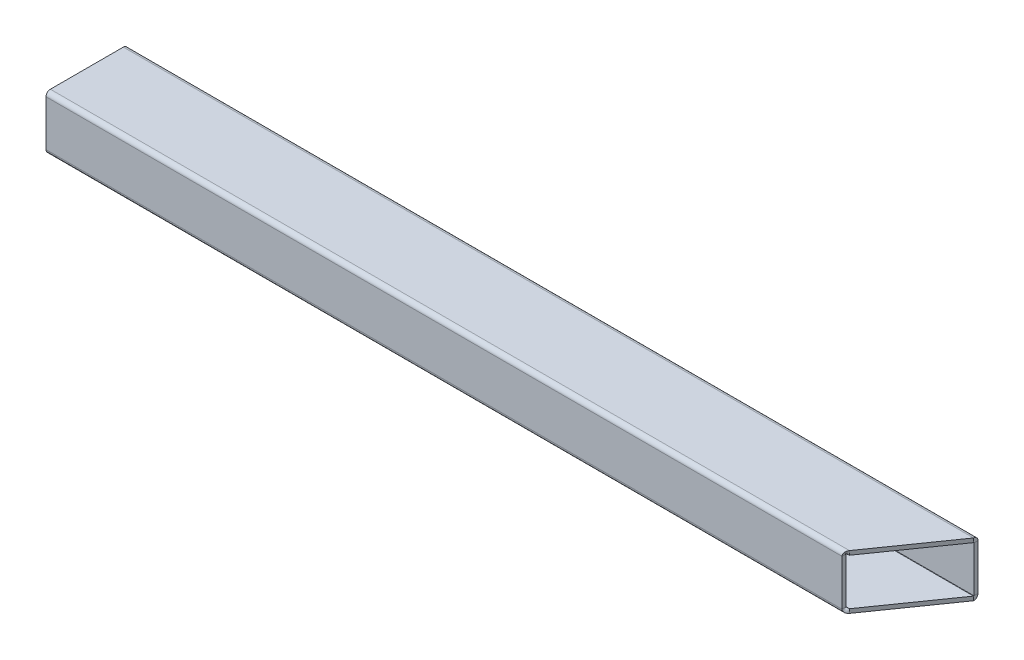
ISO-10303-21;
HEADER;
FILE_DESCRIPTION(('STEP AP214'),'2;1');
FILE_NAME('part.step','',(''),(''),'','','');
FILE_SCHEMA(('AUTOMOTIVE_DESIGN { 1 0 10303 214 1 1 1 1 }'));
ENDSEC;
DATA;
#1=APPLICATION_CONTEXT('core data for automotive mechanical design processes');
#2=APPLICATION_PROTOCOL_DEFINITION('international standard','automotive_design',2000,#1);
#3=PRODUCT_CONTEXT('',#1,'mechanical');
#4=PRODUCT('Part','Part','',(#3));
#5=PRODUCT_RELATED_PRODUCT_CATEGORY('part','',(#4));
#6=PRODUCT_DEFINITION_FORMATION('','',#4);
#7=PRODUCT_DEFINITION_CONTEXT('part definition',#1,'design');
#8=PRODUCT_DEFINITION('design','',#6,#7);
#9=PRODUCT_DEFINITION_SHAPE('','',#8);
#10=(LENGTH_UNIT() NAMED_UNIT(*) SI_UNIT(.MILLI.,.METRE.));
#11=(NAMED_UNIT(*) PLANE_ANGLE_UNIT() SI_UNIT($,.RADIAN.));
#12=(NAMED_UNIT(*) SI_UNIT($,.STERADIAN.) SOLID_ANGLE_UNIT());
#13=UNCERTAINTY_MEASURE_WITH_UNIT(LENGTH_MEASURE(1.E-05),#10,'distance_accuracy_value','');
#14=(GEOMETRIC_REPRESENTATION_CONTEXT(3) GLOBAL_UNCERTAINTY_ASSIGNED_CONTEXT((#13)) GLOBAL_UNIT_ASSIGNED_CONTEXT((#10,
#11,#12)) REPRESENTATION_CONTEXT('',''));
#15=CARTESIAN_POINT('',(0.,0.,0.));
#16=DIRECTION('',(0.,0.,1.));
#17=DIRECTION('',(1.,0.,0.));
#18=AXIS2_PLACEMENT_3D('',#15,#16,#17);
#19=CARTESIAN_POINT('',(624.619294370087,-16.8,-26.6));
#20=CARTESIAN_POINT('',(624.619294370087,-16.8,-25.6));
#21=CARTESIAN_POINT('',(624.619294370087,-16.8,-24.6));
#22=CARTESIAN_POINT('',(624.619294370087,-16.8,-23.6));
#23=CARTESIAN_POINT('',(624.619294370087,-16.4,-26.6));
#24=CARTESIAN_POINT('',(624.619294370087,-14.4,-25.6));
#25=CARTESIAN_POINT('',(624.619294370087,-12.4,-24.6));
#26=CARTESIAN_POINT('',(624.619294370087,-10.4,-23.6));
#27=CARTESIAN_POINT('',(624.899377385371,-16.4,-27.));
#28=CARTESIAN_POINT('',(624.899377385371,-14.4,-28.));
#29=CARTESIAN_POINT('',(624.899377385371,-12.4,-29.));
#30=CARTESIAN_POINT('',(624.899377385371,-10.4,-30.));
#31=CARTESIAN_POINT('',(624.899377385371,-16.8,-27.));
#32=CARTESIAN_POINT('',(624.899377385371,-16.8,-28.));
#33=CARTESIAN_POINT('',(624.899377385371,-16.8,-29.));
#34=CARTESIAN_POINT('',(624.899377385371,-16.8,-30.));
#35=CARTESIAN_POINT('',(624.899377385371,-17.2,-27.));
#36=CARTESIAN_POINT('',(624.899377385371,-19.2,-28.));
#37=CARTESIAN_POINT('',(624.899377385371,-21.2,-29.));
#38=CARTESIAN_POINT('',(624.899377385371,-23.2,-30.));
#39=CARTESIAN_POINT('',(624.619294370087,-17.2,-26.6));
#40=CARTESIAN_POINT('',(624.619294370087,-19.2,-25.6));
#41=CARTESIAN_POINT('',(624.619294370087,-21.2,-24.6));
#42=CARTESIAN_POINT('',(624.619294370087,-23.2,-23.6));
#43=CARTESIAN_POINT('',(624.619294370087,-16.8,-26.6));
#44=CARTESIAN_POINT('',(624.619294370087,-16.8,-25.6));
#45=CARTESIAN_POINT('',(624.619294370087,-16.8,-24.6));
#46=CARTESIAN_POINT('',(624.619294370087,-16.8,-23.6));
#47=(BOUNDED_SURFACE() B_SPLINE_SURFACE(3,3,((#19,#20,#21,#22),(#23,#24,#25,#26),(#27,#28,#29,
#30),(#31,#32,#33,#34),(#35,#36,#37,#38),(#39,#40,#41,#42),(#43,#44,#45,#46)),.UNSPECIFIED.,.T.,
.F.,.F.) B_SPLINE_SURFACE_WITH_KNOTS((4,3,4),(4,4),(0.,0.5,1.),(0.,1.),
.UNSPECIFIED.) GEOMETRIC_REPRESENTATION_ITEM() RATIONAL_B_SPLINE_SURFACE(((1.,1.,1.,1.),
(0.333333333333333,0.333333333333333,0.333333333333333,0.333333333333333),(0.333333333333333,
0.333333333333333,0.333333333333333,0.333333333333333),(1.,1.,1.,1.),(0.333333333333333,
0.333333333333333,0.333333333333333,0.333333333333333),(0.333333333333333,0.333333333333333,
0.333333333333333,0.333333333333333),(1.,1.,1.,1.))) REPRESENTATION_ITEM('') SURFACE());
#48=DIRECTION('',(0.,1.,0.));
#49=VECTOR('',#48,1.);
#50=CARTESIAN_POINT('',(624.759335877729,-17.,-26.8));
#51=LINE('',#50,#49);
#52=CARTESIAN_POINT('',(624.759335877729,-20.,-26.8));
#53=VERTEX_POINT('',#52);
#54=CARTESIAN_POINT('',(624.759335877729,-17.,-26.8));
#55=VERTEX_POINT('',#54);
#56=EDGE_CURVE('E12',#53,#55,#51,.T.);
#57=CARTESIAN_POINT('',(624.759335877729,-16.8,-26.8));
#58=DIRECTION('',(-0.999043774480225,0.,-0.0437211238682728));
#59=DIRECTION('',(-0.0437211238682728,0.,0.999043774480225));
#60=AXIS2_PLACEMENT_3D('',#57,#58,#59);
#61=ELLIPSE('',#60,3.20306285043904,3.20000000000001);
#62=CARTESIAN_POINT('',(624.899377385371,-16.7999999999999,-30.));
#63=VERTEX_POINT('',#62);
#64=EDGE_CURVE('E316',#63,#53,#61,.T.);
#65=DIRECTION('',(0.,0.,1.));
#66=VECTOR('',#65,1.);
#67=CARTESIAN_POINT('',(624.899377385371,-16.8,-27.));
#68=LINE('',#67,#66);
#69=CARTESIAN_POINT('',(624.899377385371,-16.8,-27.));
#70=VERTEX_POINT('',#69);
#71=EDGE_CURVE('E88',#63,#70,#68,.T.);
#72=CARTESIAN_POINT('',(624.759335877729,-16.8,-26.8));
#73=DIRECTION('',(-0.819152044288994,0.,-0.573576436351043));
#74=DIRECTION('',(-0.573576436351043,0.,0.819152044288994));
#75=AXIS2_PLACEMENT_3D('',#72,#73,#74);
#76=ELLIPSE('',#75,0.244154917752293,0.200000000000002);
#77=EDGE_CURVE('E284',#70,#55,#76,.T.);
#78=ORIENTED_EDGE('',*,*,#56,.F.);
#79=ORIENTED_EDGE('',*,*,#64,.F.);
#80=ORIENTED_EDGE('',*,*,#71,.T.);
#81=ORIENTED_EDGE('',*,*,#77,.T.);
#82=EDGE_LOOP('',(#78,#79,#80,#81));
#83=FACE_BOUND('',#82,.T.);
#84=ADVANCED_FACE('F80',(#83),#47,.T.);
#85=CARTESIAN_POINT('',(624.899377385371,-16.8,-27.));
#86=DIRECTION('',(-1.,0.,0.));
#87=DIRECTION('',(0.,-1.,0.));
#88=AXIS2_PLACEMENT_3D('',#85,#86,#87);
#89=PLANE('',#88);
#90=ORIENTED_EDGE('',*,*,#71,.F.);
#91=DIRECTION('',(0.,1.,0.));
#92=VECTOR('',#91,1.);
#93=CARTESIAN_POINT('',(624.899377385371,-16.8,-30.));
#94=LINE('',#93,#92);
#95=CARTESIAN_POINT('',(624.899377385371,16.8,-30.));
#96=VERTEX_POINT('',#95);
#97=EDGE_CURVE('E312',#96,#63,#94,.F.);
#98=ORIENTED_EDGE('',*,*,#97,.F.);
#99=DIRECTION('',(0.,0.,1.));
#100=VECTOR('',#99,1.);
#101=CARTESIAN_POINT('',(624.899377385371,16.8,-27.));
#102=LINE('',#101,#100);
#103=CARTESIAN_POINT('',(624.899377385371,16.8,-27.));
#104=VERTEX_POINT('',#103);
#105=EDGE_CURVE('E347',#96,#104,#102,.T.);
#106=ORIENTED_EDGE('',*,*,#105,.T.);
#107=DIRECTION('',(0.,-1.,0.));
#108=VECTOR('',#107,1.);
#109=CARTESIAN_POINT('',(624.899377385371,-16.8,-27.));
#110=LINE('',#109,#108);
#111=EDGE_CURVE('E275',#104,#70,#110,.T.);
#112=ORIENTED_EDGE('',*,*,#111,.T.);
#113=EDGE_LOOP('',(#90,#98,#106,#112));
#114=FACE_BOUND('',#113,.T.);
#115=ADVANCED_FACE('F360',(#114),#89,.F.);
#116=CARTESIAN_POINT('',(624.619294370087,16.8,-26.6));
#117=CARTESIAN_POINT('',(624.619294370087,16.8,-25.6));
#118=CARTESIAN_POINT('',(624.619294370087,16.8,-24.6));
#119=CARTESIAN_POINT('',(624.619294370087,16.8,-23.6));
#120=CARTESIAN_POINT('',(624.619294370087,17.2,-26.6));
#121=CARTESIAN_POINT('',(624.619294370087,19.2,-25.6));
#122=CARTESIAN_POINT('',(624.619294370087,21.2,-24.6));
#123=CARTESIAN_POINT('',(624.619294370087,23.2,-23.6));
#124=CARTESIAN_POINT('',(624.899377385371,17.2,-27.));
#125=CARTESIAN_POINT('',(624.899377385371,19.2,-28.));
#126=CARTESIAN_POINT('',(624.899377385371,21.2,-29.));
#127=CARTESIAN_POINT('',(624.899377385371,23.2,-30.));
#128=CARTESIAN_POINT('',(624.899377385371,16.8,-27.));
#129=CARTESIAN_POINT('',(624.899377385371,16.8,-28.));
#130=CARTESIAN_POINT('',(624.899377385371,16.8,-29.));
#131=CARTESIAN_POINT('',(624.899377385371,16.8,-30.));
#132=CARTESIAN_POINT('',(624.899377385371,16.4,-27.));
#133=CARTESIAN_POINT('',(624.899377385371,14.4,-28.));
#134=CARTESIAN_POINT('',(624.899377385371,12.4,-29.));
#135=CARTESIAN_POINT('',(624.899377385371,10.4,-30.));
#136=CARTESIAN_POINT('',(624.619294370087,16.4,-26.6));
#137=CARTESIAN_POINT('',(624.619294370087,14.4,-25.6));
#138=CARTESIAN_POINT('',(624.619294370087,12.4,-24.6));
#139=CARTESIAN_POINT('',(624.619294370087,10.4,-23.6));
#140=CARTESIAN_POINT('',(624.619294370087,16.8,-26.6));
#141=CARTESIAN_POINT('',(624.619294370087,16.8,-25.6));
#142=CARTESIAN_POINT('',(624.619294370087,16.8,-24.6));
#143=CARTESIAN_POINT('',(624.619294370087,16.8,-23.6));
#144=(BOUNDED_SURFACE() B_SPLINE_SURFACE(3,3,((#116,#117,#118,#119),(#120,#121,#122,#123),(#124,
#125,#126,#127),(#128,#129,#130,#131),(#132,#133,#134,#135),(#136,#137,#138,#139),(#140,#141,
#142,#143)),.UNSPECIFIED.,.T.,.F.,.F.) B_SPLINE_SURFACE_WITH_KNOTS((4,3,4),(4,4),(0.,0.5,1.),
(0.,1.),.UNSPECIFIED.) GEOMETRIC_REPRESENTATION_ITEM() RATIONAL_B_SPLINE_SURFACE(((1.,1.,1.,1.),
(0.333333333333333,0.333333333333333,0.333333333333333,0.333333333333333),(0.333333333333333,
0.333333333333333,0.333333333333333,0.333333333333333),(1.,1.,1.,1.),(0.333333333333333,
0.333333333333333,0.333333333333333,0.333333333333333),(0.333333333333333,0.333333333333333,
0.333333333333333,0.333333333333333),(1.,1.,1.,1.))) REPRESENTATION_ITEM('') SURFACE());
#145=CARTESIAN_POINT('',(624.759335877729,16.8,-26.8));
#146=DIRECTION('',(-0.999043774480225,0.,-0.0437211238682728));
#147=DIRECTION('',(-0.0437211238682728,0.,0.999043774480225));
#148=AXIS2_PLACEMENT_3D('',#145,#146,#147);
#149=ELLIPSE('',#148,3.20306285043904,3.20000000000001);
#150=CARTESIAN_POINT('',(624.759335877729,20.,-26.8));
#151=VERTEX_POINT('',#150);
#152=EDGE_CURVE('E308',#151,#96,#149,.T.);
#153=DIRECTION('',(0.,-1.,0.));
#154=VECTOR('',#153,1.);
#155=CARTESIAN_POINT('',(624.759335877729,17.,-26.8));
#156=LINE('',#155,#154);
#157=CARTESIAN_POINT('',(624.759335877729,17.,-26.8));
#158=VERTEX_POINT('',#157);
#159=EDGE_CURVE('E299',#151,#158,#156,.T.);
#160=CARTESIAN_POINT('',(624.759335877729,16.8,-26.8));
#161=DIRECTION('',(-0.819152044288994,0.,-0.573576436351043));
#162=DIRECTION('',(-0.573576436351043,0.,0.819152044288994));
#163=AXIS2_PLACEMENT_3D('',#160,#161,#162);
#164=ELLIPSE('',#163,0.244154917752293,0.200000000000002);
#165=EDGE_CURVE('E266',#158,#104,#164,.T.);
#166=ORIENTED_EDGE('',*,*,#105,.F.);
#167=ORIENTED_EDGE('',*,*,#152,.F.);
#168=ORIENTED_EDGE('',*,*,#159,.T.);
#169=ORIENTED_EDGE('',*,*,#165,.T.);
#170=EDGE_LOOP('',(#166,#167,#168,#169));
#171=FACE_BOUND('',#170,.T.);
#172=ADVANCED_FACE('F394',(#171),#144,.T.);
#173=CARTESIAN_POINT('',(600.31272956968,17.,8.11337207044921));
#174=DIRECTION('',(-0.819152044288994,0.,-0.573576436351043));
#175=DIRECTION('',(0.573576436351043,0.,-0.819152044288994));
#176=AXIS2_PLACEMENT_3D('',#173,#174,#175);
#177=PLANE('',#176);
#178=ORIENTED_EDGE('',*,*,#159,.F.);
#179=DIRECTION('',(0.573576436351043,0.,-0.819152044288994));
#180=VECTOR('',#179,1.);
#181=CARTESIAN_POINT('',(600.31272956968,20.,8.11337207044921));
#182=LINE('',#181,#180);
#183=CARTESIAN_POINT('',(587.228211829689,20.,26.8));
#184=VERTEX_POINT('',#183);
#185=EDGE_CURVE('E305',#184,#151,#182,.T.);
#186=ORIENTED_EDGE('',*,*,#185,.F.);
#187=DIRECTION('',(0.,1.,0.));
#188=VECTOR('',#187,1.);
#189=CARTESIAN_POINT('',(587.228211829689,20.,26.8));
#190=LINE('',#189,#188);
#191=CARTESIAN_POINT('',(587.228211829689,17.,26.8));
#192=VERTEX_POINT('',#191);
#193=EDGE_CURVE('E221',#192,#184,#190,.T.);
#194=ORIENTED_EDGE('',*,*,#193,.F.);
#195=DIRECTION('',(0.573576436351043,0.,-0.819152044288994));
#196=VECTOR('',#195,1.);
#197=CARTESIAN_POINT('',(600.31272956968,17.,8.11337207044921));
#198=LINE('',#197,#196);
#199=EDGE_CURVE('E257',#192,#158,#198,.T.);
#200=ORIENTED_EDGE('',*,*,#199,.T.);
#201=EDGE_LOOP('',(#178,#186,#194,#200));
#202=FACE_BOUND('',#201,.T.);
#203=ADVANCED_FACE('F417',(#202),#177,.F.);
#204=CARTESIAN_POINT('',(625.496491806743,-17.,-27.8527677706789));
#205=DIRECTION('',(-0.819152044288994,0.,-0.573576436351043));
#206=DIRECTION('',(-0.573576436351043,0.,0.819152044288994));
#207=AXIS2_PLACEMENT_3D('',#204,#205,#206);
#208=PLANE('',#207);
#209=DIRECTION('',(-0.573576436351043,0.,0.819152044288994));
#210=VECTOR('',#209,1.);
#211=CARTESIAN_POINT('',(625.496491806743,-20.,-27.8527677706789));
#212=LINE('',#211,#210);
#213=CARTESIAN_POINT('',(587.228211829689,-20.,26.8000000000002));
#214=VERTEX_POINT('',#213);
#215=EDGE_CURVE('E320',#53,#214,#212,.T.);
#216=ORIENTED_EDGE('',*,*,#215,.F.);
#217=ORIENTED_EDGE('',*,*,#56,.T.);
#218=DIRECTION('',(-0.573576436351043,0.,0.819152044288994));
#219=VECTOR('',#218,1.);
#220=CARTESIAN_POINT('',(625.496491806743,-17.,-27.8527677706789));
#221=LINE('',#220,#219);
#222=CARTESIAN_POINT('',(587.228211829689,-17.,26.8));
#223=VERTEX_POINT('',#222);
#224=EDGE_CURVE('E293',#55,#223,#221,.T.);
#225=ORIENTED_EDGE('',*,*,#224,.T.);
#226=DIRECTION('',(0.,-1.,0.));
#227=VECTOR('',#226,1.);
#228=CARTESIAN_POINT('',(587.228211829689,-20.,26.8));
#229=LINE('',#228,#227);
#230=EDGE_CURVE('E235',#223,#214,#229,.T.);
#231=ORIENTED_EDGE('',*,*,#230,.T.);
#232=EDGE_LOOP('',(#216,#217,#225,#231));
#233=FACE_BOUND('',#232,.T.);
#234=ADVANCED_FACE('F374',(#233),#208,.F.);
#235=CARTESIAN_POINT('',(0.,16.8,27.));
#236=DIRECTION('',(1.,0.,0.));
#237=DIRECTION('',(0.,-1.,0.));
#238=AXIS2_PLACEMENT_3D('',#235,#236,#237);
#239=PLANE('',#238);
#240=DIRECTION('',(0.,-1.,0.));
#241=VECTOR('',#240,1.);
#242=CARTESIAN_POINT('',(0.,16.8,27.));
#243=LINE('',#242,#241);
#244=CARTESIAN_POINT('',(0.,16.8,27.));
#245=VERTEX_POINT('',#244);
#246=CARTESIAN_POINT('',(0.,-16.8,27.));
#247=VERTEX_POINT('',#246);
#248=EDGE_CURVE('E246',#245,#247,#243,.T.);
#249=ORIENTED_EDGE('',*,*,#248,.T.);
#250=CARTESIAN_POINT('',(0.,-16.8,26.8));
#251=DIRECTION('',(1.,0.,0.));
#252=DIRECTION('',(0.,0.,-1.));
#253=AXIS2_PLACEMENT_3D('',#250,#251,#252);
#254=CIRCLE('',#253,0.200000000000002);
#255=CARTESIAN_POINT('',(0.,-17.,26.8));
#256=VERTEX_POINT('',#255);
#257=EDGE_CURVE('E241',#247,#256,#254,.T.);
#258=ORIENTED_EDGE('',*,*,#257,.T.);
#259=DIRECTION('',(0.,0.,-1.));
#260=VECTOR('',#259,1.);
#261=CARTESIAN_POINT('',(0.,-17.,-26.8));
#262=LINE('',#261,#260);
#263=CARTESIAN_POINT('',(0.,-17.,-26.8));
#264=VERTEX_POINT('',#263);
#265=EDGE_CURVE('E296',#256,#264,#262,.T.);
#266=ORIENTED_EDGE('',*,*,#265,.T.);
#267=CARTESIAN_POINT('',(0.,-16.8,-26.8));
#268=DIRECTION('',(1.,0.,0.));
#269=DIRECTION('',(0.,0.,-1.));
#270=AXIS2_PLACEMENT_3D('',#267,#268,#269);
#271=CIRCLE('',#270,0.200000000000002);
#272=CARTESIAN_POINT('',(0.,-16.8,-27.));
#273=VERTEX_POINT('',#272);
#274=EDGE_CURVE('E287',#264,#273,#271,.T.);
#275=ORIENTED_EDGE('',*,*,#274,.T.);
#276=DIRECTION('',(0.,1.,0.));
#277=VECTOR('',#276,1.);
#278=CARTESIAN_POINT('',(0.,-16.8,-27.));
#279=LINE('',#278,#277);
#280=CARTESIAN_POINT('',(0.,16.8,-27.));
#281=VERTEX_POINT('',#280);
#282=EDGE_CURVE('E278',#273,#281,#279,.T.);
#283=ORIENTED_EDGE('',*,*,#282,.T.);
#284=CARTESIAN_POINT('',(0.,16.8,-26.8));
#285=DIRECTION('',(1.,0.,0.));
#286=DIRECTION('',(0.,0.,-1.));
#287=AXIS2_PLACEMENT_3D('',#284,#285,#286);
#288=CIRCLE('',#287,0.200000000000002);
#289=CARTESIAN_POINT('',(0.,17.,-26.8));
#290=VERTEX_POINT('',#289);
#291=EDGE_CURVE('E269',#281,#290,#288,.T.);
#292=ORIENTED_EDGE('',*,*,#291,.T.);
#293=DIRECTION('',(0.,0.,1.));
#294=VECTOR('',#293,1.);
#295=CARTESIAN_POINT('',(0.,17.,26.8));
#296=LINE('',#295,#294);
#297=CARTESIAN_POINT('',(0.,17.,26.8));
#298=VERTEX_POINT('',#297);
#299=EDGE_CURVE('E260',#290,#298,#296,.T.);
#300=ORIENTED_EDGE('',*,*,#299,.T.);
#301=CARTESIAN_POINT('',(0.,16.8,26.8));
#302=DIRECTION('',(1.,0.,0.));
#303=DIRECTION('',(0.,0.,-1.));
#304=AXIS2_PLACEMENT_3D('',#301,#302,#303);
#305=CIRCLE('',#304,0.200000000000002);
#306=EDGE_CURVE('E251',#298,#245,#305,.T.);
#307=ORIENTED_EDGE('',*,*,#306,.T.);
#308=EDGE_LOOP('',(#249,#258,#266,#275,#283,#292,#300,#307));
#309=FACE_BOUND('',#308,.T.);
#310=DIRECTION('',(0.,1.,0.));
#311=VECTOR('',#310,1.);
#312=CARTESIAN_POINT('',(0.,16.8,30.));
#313=LINE('',#312,#311);
#314=CARTESIAN_POINT('',(0.,16.8,30.));
#315=VERTEX_POINT('',#314);
#316=CARTESIAN_POINT('',(0.,-16.7999999999999,30.));
#317=VERTEX_POINT('',#316);
#318=EDGE_CURVE('E203',#315,#317,#313,.F.);
#319=ORIENTED_EDGE('',*,*,#318,.F.);
#320=CARTESIAN_POINT('',(0.,16.8,26.8));
#321=DIRECTION('',(-1.,0.,0.));
#322=DIRECTION('',(0.,0.,1.));
#323=AXIS2_PLACEMENT_3D('',#320,#321,#322);
#324=CIRCLE('',#323,3.20000000000001);
#325=CARTESIAN_POINT('',(0.,20.,26.8));
#326=VERTEX_POINT('',#325);
#327=EDGE_CURVE('E199',#326,#315,#324,.F.);
#328=ORIENTED_EDGE('',*,*,#327,.F.);
#329=DIRECTION('',(0.,0.,-1.));
#330=VECTOR('',#329,1.);
#331=CARTESIAN_POINT('',(0.,20.,26.8));
#332=LINE('',#331,#330);
#333=CARTESIAN_POINT('',(0.,20.,-26.8));
#334=VERTEX_POINT('',#333);
#335=EDGE_CURVE('E309',#334,#326,#332,.F.);
#336=ORIENTED_EDGE('',*,*,#335,.F.);
#337=CARTESIAN_POINT('',(0.,16.8,-26.8));
#338=DIRECTION('',(-1.,0.,0.));
#339=DIRECTION('',(0.,0.,1.));
#340=AXIS2_PLACEMENT_3D('',#337,#338,#339);
#341=CIRCLE('',#340,3.20000000000001);
#342=CARTESIAN_POINT('',(0.,16.7999999999999,-30.));
#343=VERTEX_POINT('',#342);
#344=EDGE_CURVE('E313',#343,#334,#341,.F.);
#345=ORIENTED_EDGE('',*,*,#344,.F.);
#346=DIRECTION('',(0.,1.,0.));
#347=VECTOR('',#346,1.);
#348=CARTESIAN_POINT('',(0.,-16.8,-30.));
#349=LINE('',#348,#347);
#350=CARTESIAN_POINT('',(0.,-16.8,-30.));
#351=VERTEX_POINT('',#350);
#352=EDGE_CURVE('E317',#351,#343,#349,.T.);
#353=ORIENTED_EDGE('',*,*,#352,.F.);
#354=CARTESIAN_POINT('',(0.,-16.8,-26.8));
#355=DIRECTION('',(-1.,0.,0.));
#356=DIRECTION('',(0.,0.,1.));
#357=AXIS2_PLACEMENT_3D('',#354,#355,#356);
#358=CIRCLE('',#357,3.20000000000001);
#359=CARTESIAN_POINT('',(0.,-20.,-26.8));
#360=VERTEX_POINT('',#359);
#361=EDGE_CURVE('E321',#360,#351,#358,.F.);
#362=ORIENTED_EDGE('',*,*,#361,.F.);
#363=DIRECTION('',(0.,0.,1.));
#364=VECTOR('',#363,1.);
#365=CARTESIAN_POINT('',(0.,-20.,-26.8));
#366=LINE('',#365,#364);
#367=CARTESIAN_POINT('',(0.,-20.,26.8));
#368=VERTEX_POINT('',#367);
#369=EDGE_CURVE('E242',#368,#360,#366,.F.);
#370=ORIENTED_EDGE('',*,*,#369,.F.);
#371=CARTESIAN_POINT('',(0.,-16.8,26.8));
#372=DIRECTION('',(-1.,0.,0.));
#373=DIRECTION('',(0.,0.,1.));
#374=AXIS2_PLACEMENT_3D('',#371,#372,#373);
#375=CIRCLE('',#374,3.20000000000001);
#376=EDGE_CURVE('E301',#317,#368,#375,.F.);
#377=ORIENTED_EDGE('',*,*,#376,.F.);
#378=EDGE_LOOP('',(#319,#328,#336,#345,#353,#362,#370,#377));
#379=FACE_BOUND('',#378,.T.);
#380=ADVANCED_FACE('F82',(#309,#379),#239,.F.);
#381=CARTESIAN_POINT('',(627.,-16.8,26.8));
#382=DIRECTION('',(-1.,0.,0.));
#383=DIRECTION('',(0.,0.,1.));
#384=AXIS2_PLACEMENT_3D('',#381,#382,#383);
#385=CYLINDRICAL_SURFACE('',#384,0.200000000000002);
#386=DIRECTION('',(-1.,0.,0.));
#387=VECTOR('',#386,1.);
#388=CARTESIAN_POINT('',(627.,-16.8,27.));
#389=LINE('',#388,#387);
#390=CARTESIAN_POINT('',(584.987547707418,-16.8,27.));
#391=VERTEX_POINT('',#390);
#392=EDGE_CURVE('E244',#391,#247,#389,.T.);
#393=ORIENTED_EDGE('',*,*,#392,.F.);
#394=CARTESIAN_POINT('',(587.228211829689,-16.8,26.8));
#395=DIRECTION('',(-0.0889057873463323,0.,-0.996040039845954));
#396=DIRECTION('',(-0.996040039845954,0.,0.0889057873463323));
#397=AXIS2_PLACEMENT_3D('',#394,#395,#396);
#398=ELLIPSE('',#397,2.24957233909756,0.199999999999997);
#399=EDGE_CURVE('E231',#223,#391,#398,.T.);
#400=ORIENTED_EDGE('',*,*,#399,.F.);
#401=DIRECTION('',(-1.,0.,0.));
#402=VECTOR('',#401,1.);
#403=CARTESIAN_POINT('',(627.,-17.,26.8));
#404=LINE('',#403,#402);
#405=EDGE_CURVE('E238',#223,#256,#404,.T.);
#406=ORIENTED_EDGE('',*,*,#405,.T.);
#407=ORIENTED_EDGE('',*,*,#257,.F.);
#408=EDGE_LOOP('',(#393,#400,#406,#407));
#409=FACE_BOUND('',#408,.T.);
#410=ADVANCED_FACE('F406',(#409),#385,.F.);
#411=CARTESIAN_POINT('',(627.,16.8,27.));
#412=DIRECTION('',(0.,0.,-1.));
#413=DIRECTION('',(-1.,0.,0.));
#414=AXIS2_PLACEMENT_3D('',#411,#412,#413);
#415=PLANE('',#414);
#416=DIRECTION('',(-1.,0.,0.));
#417=VECTOR('',#416,1.);
#418=CARTESIAN_POINT('',(627.,16.8,27.));
#419=LINE('',#418,#417);
#420=CARTESIAN_POINT('',(584.987547707418,16.8,27.));
#421=VERTEX_POINT('',#420);
#422=EDGE_CURVE('E249',#421,#245,#419,.T.);
#423=ORIENTED_EDGE('',*,*,#422,.F.);
#424=DIRECTION('',(0.,1.,0.));
#425=VECTOR('',#424,1.);
#426=CARTESIAN_POINT('',(584.987547707418,16.8,27.));
#427=LINE('',#426,#425);
#428=EDGE_CURVE('E95',#421,#391,#427,.F.);
#429=ORIENTED_EDGE('',*,*,#428,.T.);
#430=ORIENTED_EDGE('',*,*,#392,.T.);
#431=ORIENTED_EDGE('',*,*,#248,.F.);
#432=EDGE_LOOP('',(#423,#429,#430,#431));
#433=FACE_BOUND('',#432,.T.);
#434=ADVANCED_FACE('F404',(#433),#415,.T.);
#435=CARTESIAN_POINT('',(627.,16.8,26.8));
#436=DIRECTION('',(-1.,0.,0.));
#437=DIRECTION('',(0.,0.,1.));
#438=AXIS2_PLACEMENT_3D('',#435,#436,#437);
#439=CYLINDRICAL_SURFACE('',#438,0.200000000000002);
#440=DIRECTION('',(-1.,0.,0.));
#441=VECTOR('',#440,1.);
#442=CARTESIAN_POINT('',(627.,17.,26.8));
#443=LINE('',#442,#441);
#444=EDGE_CURVE('E254',#192,#298,#443,.T.);
#445=ORIENTED_EDGE('',*,*,#444,.F.);
#446=CARTESIAN_POINT('',(587.228211829689,16.8,26.8));
#447=DIRECTION('',(-0.0889057873463323,0.,-0.996040039845954));
#448=DIRECTION('',(-0.996040039845954,0.,0.0889057873463323));
#449=AXIS2_PLACEMENT_3D('',#446,#447,#448);
#450=ELLIPSE('',#449,2.24957233909756,0.199999999999997);
#451=EDGE_CURVE('E103',#421,#192,#450,.T.);
#452=ORIENTED_EDGE('',*,*,#451,.F.);
#453=ORIENTED_EDGE('',*,*,#422,.T.);
#454=ORIENTED_EDGE('',*,*,#306,.F.);
#455=EDGE_LOOP('',(#445,#452,#453,#454));
#456=FACE_BOUND('',#455,.T.);
#457=ADVANCED_FACE('F402',(#456),#439,.F.);
#458=CARTESIAN_POINT('',(627.,17.,26.8));
#459=DIRECTION('',(0.,-1.,0.));
#460=DIRECTION('',(0.,0.,-1.));
#461=AXIS2_PLACEMENT_3D('',#458,#459,#460);
#462=PLANE('',#461);
#463=ORIENTED_EDGE('',*,*,#199,.F.);
#464=ORIENTED_EDGE('',*,*,#444,.T.);
#465=ORIENTED_EDGE('',*,*,#299,.F.);
#466=DIRECTION('',(-1.,0.,0.));
#467=VECTOR('',#466,1.);
#468=CARTESIAN_POINT('',(627.,17.,-26.8));
#469=LINE('',#468,#467);
#470=EDGE_CURVE('E263',#158,#290,#469,.T.);
#471=ORIENTED_EDGE('',*,*,#470,.F.);
#472=EDGE_LOOP('',(#463,#464,#465,#471));
#473=FACE_BOUND('',#472,.T.);
#474=ADVANCED_FACE('F401',(#473),#462,.T.);
#475=CARTESIAN_POINT('',(627.,16.8,-26.8));
#476=DIRECTION('',(-1.,0.,0.));
#477=DIRECTION('',(0.,0.,1.));
#478=AXIS2_PLACEMENT_3D('',#475,#476,#477);
#479=CYLINDRICAL_SURFACE('',#478,0.200000000000002);
#480=ORIENTED_EDGE('',*,*,#165,.F.);
#481=ORIENTED_EDGE('',*,*,#470,.T.);
#482=ORIENTED_EDGE('',*,*,#291,.F.);
#483=DIRECTION('',(-1.,0.,0.));
#484=VECTOR('',#483,1.);
#485=CARTESIAN_POINT('',(627.,16.8,-27.));
#486=LINE('',#485,#484);
#487=EDGE_CURVE('E272',#104,#281,#486,.T.);
#488=ORIENTED_EDGE('',*,*,#487,.F.);
#489=EDGE_LOOP('',(#480,#481,#482,#488));
#490=FACE_BOUND('',#489,.T.);
#491=ADVANCED_FACE('F397',(#490),#479,.F.);
#492=CARTESIAN_POINT('',(627.,-16.8,-27.));
#493=DIRECTION('',(0.,0.,1.));
#494=DIRECTION('',(1.,0.,0.));
#495=AXIS2_PLACEMENT_3D('',#492,#493,#494);
#496=PLANE('',#495);
#497=ORIENTED_EDGE('',*,*,#111,.F.);
#498=ORIENTED_EDGE('',*,*,#487,.T.);
#499=ORIENTED_EDGE('',*,*,#282,.F.);
#500=DIRECTION('',(-1.,0.,0.));
#501=VECTOR('',#500,1.);
#502=CARTESIAN_POINT('',(627.,-16.8,-27.));
#503=LINE('',#502,#501);
#504=EDGE_CURVE('E281',#70,#273,#503,.T.);
#505=ORIENTED_EDGE('',*,*,#504,.F.);
#506=EDGE_LOOP('',(#497,#498,#499,#505));
#507=FACE_BOUND('',#506,.T.);
#508=ADVANCED_FACE('F362',(#507),#496,.T.);
#509=CARTESIAN_POINT('',(627.,-16.8,-26.8));
#510=DIRECTION('',(-1.,0.,0.));
#511=DIRECTION('',(0.,0.,1.));
#512=AXIS2_PLACEMENT_3D('',#509,#510,#511);
#513=CYLINDRICAL_SURFACE('',#512,0.200000000000002);
#514=ORIENTED_EDGE('',*,*,#77,.F.);
#515=ORIENTED_EDGE('',*,*,#504,.T.);
#516=ORIENTED_EDGE('',*,*,#274,.F.);
#517=DIRECTION('',(-1.,0.,0.));
#518=VECTOR('',#517,1.);
#519=CARTESIAN_POINT('',(627.,-17.,-26.8));
#520=LINE('',#519,#518);
#521=EDGE_CURVE('E290',#55,#264,#520,.T.);
#522=ORIENTED_EDGE('',*,*,#521,.F.);
#523=EDGE_LOOP('',(#514,#515,#516,#522));
#524=FACE_BOUND('',#523,.T.);
#525=ADVANCED_FACE('F357',(#524),#513,.F.);
#526=CARTESIAN_POINT('',(627.,-17.,-26.8));
#527=DIRECTION('',(0.,1.,0.));
#528=DIRECTION('',(0.,0.,1.));
#529=AXIS2_PLACEMENT_3D('',#526,#527,#528);
#530=PLANE('',#529);
#531=ORIENTED_EDGE('',*,*,#224,.F.);
#532=ORIENTED_EDGE('',*,*,#521,.T.);
#533=ORIENTED_EDGE('',*,*,#265,.F.);
#534=ORIENTED_EDGE('',*,*,#405,.F.);
#535=EDGE_LOOP('',(#531,#532,#533,#534));
#536=FACE_BOUND('',#535,.T.);
#537=ADVANCED_FACE('F370',(#536),#530,.T.);
#538=CARTESIAN_POINT('',(627.,-16.8,26.8));
#539=DIRECTION('',(-1.,0.,0.));
#540=DIRECTION('',(0.,0.,1.));
#541=AXIS2_PLACEMENT_3D('',#538,#539,#540);
#542=CYLINDRICAL_SURFACE('',#541,3.20000000000001);
#543=CARTESIAN_POINT('',(587.228211829689,-16.8,26.8));
#544=DIRECTION('',(-0.819152044288994,0.,-0.573576436351043));
#545=DIRECTION('',(-0.573576436351043,0.,0.819152044288994));
#546=AXIS2_PLACEMENT_3D('',#543,#544,#545);
#547=ELLIPSE('',#546,3.90647868403665,3.2);
#548=CARTESIAN_POINT('',(584.987547707418,-16.8,30.));
#549=VERTEX_POINT('',#548);
#550=EDGE_CURVE('E214',#214,#549,#547,.T.);
#551=ORIENTED_EDGE('',*,*,#550,.T.);
#552=DIRECTION('',(-1.,0.,0.));
#553=VECTOR('',#552,1.);
#554=CARTESIAN_POINT('',(627.,-16.8,30.));
#555=LINE('',#554,#553);
#556=EDGE_CURVE('E210',#549,#317,#555,.T.);
#557=ORIENTED_EDGE('',*,*,#556,.T.);
#558=ORIENTED_EDGE('',*,*,#376,.T.);
#559=DIRECTION('',(-1.,0.,0.));
#560=VECTOR('',#559,1.);
#561=CARTESIAN_POINT('',(627.,-20.,26.8));
#562=LINE('',#561,#560);
#563=EDGE_CURVE('E237',#214,#368,#562,.T.);
#564=ORIENTED_EDGE('',*,*,#563,.F.);
#565=EDGE_LOOP('',(#551,#557,#558,#564));
#566=FACE_BOUND('',#565,.T.);
#567=ADVANCED_FACE('F410',(#566),#542,.T.);
#568=CARTESIAN_POINT('',(627.,16.8,30.));
#569=DIRECTION('',(0.,0.,-1.));
#570=DIRECTION('',(-1.,0.,0.));
#571=AXIS2_PLACEMENT_3D('',#568,#569,#570);
#572=PLANE('',#571);
#573=DIRECTION('',(0.,-1.,0.));
#574=VECTOR('',#573,1.);
#575=CARTESIAN_POINT('',(584.987547707418,20.,30.));
#576=LINE('',#575,#574);
#577=CARTESIAN_POINT('',(584.987547707418,16.8,30.));
#578=VERTEX_POINT('',#577);
#579=EDGE_CURVE('E207',#578,#549,#576,.T.);
#580=ORIENTED_EDGE('',*,*,#579,.F.);
#581=DIRECTION('',(-1.,0.,0.));
#582=VECTOR('',#581,1.);
#583=CARTESIAN_POINT('',(627.,16.7999999999999,30.));
#584=LINE('',#583,#582);
#585=EDGE_CURVE('E192',#578,#315,#584,.T.);
#586=ORIENTED_EDGE('',*,*,#585,.T.);
#587=ORIENTED_EDGE('',*,*,#318,.T.);
#588=ORIENTED_EDGE('',*,*,#556,.F.);
#589=EDGE_LOOP('',(#580,#586,#587,#588));
#590=FACE_BOUND('',#589,.T.);
#591=ADVANCED_FACE('F209',(#590),#572,.F.);
#592=CARTESIAN_POINT('',(627.,16.8,26.8));
#593=DIRECTION('',(-1.,0.,0.));
#594=DIRECTION('',(0.,0.,1.));
#595=AXIS2_PLACEMENT_3D('',#592,#593,#594);
#596=CYLINDRICAL_SURFACE('',#595,3.20000000000001);
#597=CARTESIAN_POINT('',(587.228211829689,16.8,26.8));
#598=DIRECTION('',(-0.819152044288994,0.,-0.573576436351043));
#599=DIRECTION('',(-0.573576436351043,0.,0.819152044288994));
#600=AXIS2_PLACEMENT_3D('',#597,#598,#599);
#601=ELLIPSE('',#600,3.90647868403665,3.2);
#602=EDGE_CURVE('E196',#578,#184,#601,.T.);
#603=ORIENTED_EDGE('',*,*,#602,.T.);
#604=DIRECTION('',(1.,0.,0.));
#605=VECTOR('',#604,1.);
#606=CARTESIAN_POINT('',(627.,20.,26.8));
#607=LINE('',#606,#605);
#608=EDGE_CURVE('E303',#184,#326,#607,.F.);
#609=ORIENTED_EDGE('',*,*,#608,.T.);
#610=ORIENTED_EDGE('',*,*,#327,.T.);
#611=ORIENTED_EDGE('',*,*,#585,.F.);
#612=EDGE_LOOP('',(#603,#609,#610,#611));
#613=FACE_BOUND('',#612,.T.);
#614=ADVANCED_FACE('F194',(#613),#596,.T.);
#615=CARTESIAN_POINT('',(627.,20.,26.8));
#616=DIRECTION('',(0.,-1.,0.));
#617=DIRECTION('',(0.,0.,-1.));
#618=AXIS2_PLACEMENT_3D('',#615,#616,#617);
#619=PLANE('',#618);
#620=ORIENTED_EDGE('',*,*,#185,.T.);
#621=DIRECTION('',(-1.,0.,0.));
#622=VECTOR('',#621,1.);
#623=CARTESIAN_POINT('',(627.,20.,-26.8));
#624=LINE('',#623,#622);
#625=EDGE_CURVE('E306',#151,#334,#624,.T.);
#626=ORIENTED_EDGE('',*,*,#625,.T.);
#627=ORIENTED_EDGE('',*,*,#335,.T.);
#628=ORIENTED_EDGE('',*,*,#608,.F.);
#629=EDGE_LOOP('',(#620,#626,#627,#628));
#630=FACE_BOUND('',#629,.T.);
#631=ADVANCED_FACE('F414',(#630),#619,.F.);
#632=CARTESIAN_POINT('',(627.,16.8,-26.8));
#633=DIRECTION('',(-1.,0.,0.));
#634=DIRECTION('',(0.,0.,1.));
#635=AXIS2_PLACEMENT_3D('',#632,#633,#634);
#636=CYLINDRICAL_SURFACE('',#635,3.20000000000001);
#637=ORIENTED_EDGE('',*,*,#152,.T.);
#638=DIRECTION('',(1.,0.,0.));
#639=VECTOR('',#638,1.);
#640=CARTESIAN_POINT('',(627.,16.8,-30.));
#641=LINE('',#640,#639);
#642=EDGE_CURVE('E310',#96,#343,#641,.F.);
#643=ORIENTED_EDGE('',*,*,#642,.T.);
#644=ORIENTED_EDGE('',*,*,#344,.T.);
#645=ORIENTED_EDGE('',*,*,#625,.F.);
#646=EDGE_LOOP('',(#637,#643,#644,#645));
#647=FACE_BOUND('',#646,.T.);
#648=ADVANCED_FACE('F392',(#647),#636,.T.);
#649=CARTESIAN_POINT('',(627.,-16.8,-30.));
#650=DIRECTION('',(0.,0.,1.));
#651=DIRECTION('',(1.,0.,0.));
#652=AXIS2_PLACEMENT_3D('',#649,#650,#651);
#653=PLANE('',#652);
#654=ORIENTED_EDGE('',*,*,#97,.T.);
#655=DIRECTION('',(-1.,0.,0.));
#656=VECTOR('',#655,1.);
#657=CARTESIAN_POINT('',(627.,-16.7999999999999,-30.));
#658=LINE('',#657,#656);
#659=EDGE_CURVE('E314',#63,#351,#658,.T.);
#660=ORIENTED_EDGE('',*,*,#659,.T.);
#661=ORIENTED_EDGE('',*,*,#352,.T.);
#662=ORIENTED_EDGE('',*,*,#642,.F.);
#663=EDGE_LOOP('',(#654,#660,#661,#662));
#664=FACE_BOUND('',#663,.T.);
#665=ADVANCED_FACE('F387',(#664),#653,.F.);
#666=CARTESIAN_POINT('',(627.,-16.8,-26.8));
#667=DIRECTION('',(-1.,0.,0.));
#668=DIRECTION('',(0.,0.,1.));
#669=AXIS2_PLACEMENT_3D('',#666,#667,#668);
#670=CYLINDRICAL_SURFACE('',#669,3.20000000000001);
#671=ORIENTED_EDGE('',*,*,#64,.T.);
#672=DIRECTION('',(1.,0.,0.));
#673=VECTOR('',#672,1.);
#674=CARTESIAN_POINT('',(627.,-20.,-26.8));
#675=LINE('',#674,#673);
#676=EDGE_CURVE('E318',#53,#360,#675,.F.);
#677=ORIENTED_EDGE('',*,*,#676,.T.);
#678=ORIENTED_EDGE('',*,*,#361,.T.);
#679=ORIENTED_EDGE('',*,*,#659,.F.);
#680=EDGE_LOOP('',(#671,#677,#678,#679));
#681=FACE_BOUND('',#680,.T.);
#682=ADVANCED_FACE('F383',(#681),#670,.T.);
#683=CARTESIAN_POINT('',(627.,-20.,-26.8));
#684=DIRECTION('',(0.,1.,0.));
#685=DIRECTION('',(0.,0.,1.));
#686=AXIS2_PLACEMENT_3D('',#683,#684,#685);
#687=PLANE('',#686);
#688=ORIENTED_EDGE('',*,*,#215,.T.);
#689=ORIENTED_EDGE('',*,*,#563,.T.);
#690=ORIENTED_EDGE('',*,*,#369,.T.);
#691=ORIENTED_EDGE('',*,*,#676,.F.);
#692=EDGE_LOOP('',(#688,#689,#690,#691));
#693=FACE_BOUND('',#692,.T.);
#694=ADVANCED_FACE('F378',(#693),#687,.F.);
#695=CARTESIAN_POINT('',(584.987547707418,-16.8,27.));
#696=CARTESIAN_POINT('',(584.987547707418,-16.8,28.));
#697=CARTESIAN_POINT('',(584.987547707418,-16.8,29.));
#698=CARTESIAN_POINT('',(584.987547707418,-16.8,30.));
#699=CARTESIAN_POINT('',(584.987547707418,-16.4,27.));
#700=CARTESIAN_POINT('',(584.987547707418,-14.4,28.));
#701=CARTESIAN_POINT('',(584.987547707418,-12.4,29.));
#702=CARTESIAN_POINT('',(584.987547707418,-10.4,30.));
#703=CARTESIAN_POINT('',(589.46887595196,-16.4,26.6));
#704=CARTESIAN_POINT('',(589.46887595196,-14.4,25.6));
#705=CARTESIAN_POINT('',(589.46887595196,-12.4,24.6));
#706=CARTESIAN_POINT('',(589.46887595196,-10.4,23.6));
#707=CARTESIAN_POINT('',(589.46887595196,-16.8,26.6));
#708=CARTESIAN_POINT('',(589.46887595196,-16.8,25.6));
#709=CARTESIAN_POINT('',(589.46887595196,-16.8,24.6));
#710=CARTESIAN_POINT('',(589.46887595196,-16.8,23.6));
#711=CARTESIAN_POINT('',(589.46887595196,-17.2,26.6));
#712=CARTESIAN_POINT('',(589.46887595196,-19.2,25.6));
#713=CARTESIAN_POINT('',(589.46887595196,-21.2,24.6));
#714=CARTESIAN_POINT('',(589.46887595196,-23.2,23.6));
#715=CARTESIAN_POINT('',(584.987547707418,-17.2,27.));
#716=CARTESIAN_POINT('',(584.987547707418,-19.2,28.));
#717=CARTESIAN_POINT('',(584.987547707418,-21.2,29.));
#718=CARTESIAN_POINT('',(584.987547707418,-23.2,30.));
#719=CARTESIAN_POINT('',(584.987547707418,-16.8,27.));
#720=CARTESIAN_POINT('',(584.987547707418,-16.8,28.));
#721=CARTESIAN_POINT('',(584.987547707418,-16.8,29.));
#722=CARTESIAN_POINT('',(584.987547707418,-16.8,30.));
#723=(BOUNDED_SURFACE() B_SPLINE_SURFACE(3,3,((#695,#696,#697,#698),(#699,#700,#701,#702),(#703,
#704,#705,#706),(#707,#708,#709,#710),(#711,#712,#713,#714),(#715,#716,#717,#718),(#719,#720,
#721,#722)),.UNSPECIFIED.,.T.,.F.,.F.) B_SPLINE_SURFACE_WITH_KNOTS((4,3,4),(4,4),(0.,0.5,1.),
(0.,1.),.UNSPECIFIED.) GEOMETRIC_REPRESENTATION_ITEM() RATIONAL_B_SPLINE_SURFACE(((1.,1.,1.,1.),
(0.333333333333333,0.333333333333333,0.333333333333333,0.333333333333333),(0.333333333333333,
0.333333333333333,0.333333333333333,0.333333333333333),(1.,1.,1.,1.),(0.333333333333333,
0.333333333333333,0.333333333333333,0.333333333333333),(0.333333333333333,0.333333333333333,
0.333333333333333,0.333333333333333),(1.,1.,1.,1.))) REPRESENTATION_ITEM('') SURFACE());
#724=DIRECTION('',(0.,0.,1.));
#725=VECTOR('',#724,1.);
#726=CARTESIAN_POINT('',(584.987547707418,-16.8,30.));
#727=LINE('',#726,#725);
#728=EDGE_CURVE('E220',#391,#549,#727,.T.);
#729=ORIENTED_EDGE('',*,*,#230,.F.);
#730=ORIENTED_EDGE('',*,*,#399,.T.);
#731=ORIENTED_EDGE('',*,*,#728,.T.);
#732=ORIENTED_EDGE('',*,*,#550,.F.);
#733=EDGE_LOOP('',(#729,#730,#731,#732));
#734=FACE_BOUND('',#733,.T.);
#735=ADVANCED_FACE('F408',(#734),#723,.T.);
#736=CARTESIAN_POINT('',(584.987547707418,20.,30.));
#737=DIRECTION('',(1.,0.,0.));
#738=DIRECTION('',(0.,-1.,0.));
#739=AXIS2_PLACEMENT_3D('',#736,#737,#738);
#740=PLANE('',#739);
#741=ORIENTED_EDGE('',*,*,#728,.F.);
#742=ORIENTED_EDGE('',*,*,#428,.F.);
#743=DIRECTION('',(0.,0.,1.));
#744=VECTOR('',#743,1.);
#745=CARTESIAN_POINT('',(584.987547707418,16.8,30.));
#746=LINE('',#745,#744);
#747=EDGE_CURVE('E217',#421,#578,#746,.T.);
#748=ORIENTED_EDGE('',*,*,#747,.T.);
#749=ORIENTED_EDGE('',*,*,#579,.T.);
#750=EDGE_LOOP('',(#741,#742,#748,#749));
#751=FACE_BOUND('',#750,.T.);
#752=ADVANCED_FACE('F218',(#751),#740,.T.);
#753=CARTESIAN_POINT('',(584.987547707418,16.8,27.));
#754=CARTESIAN_POINT('',(584.987547707418,16.8,28.));
#755=CARTESIAN_POINT('',(584.987547707418,16.8,29.));
#756=CARTESIAN_POINT('',(584.987547707418,16.8,30.));
#757=CARTESIAN_POINT('',(584.987547707418,17.2,27.));
#758=CARTESIAN_POINT('',(584.987547707418,19.2,28.));
#759=CARTESIAN_POINT('',(584.987547707418,21.2,29.));
#760=CARTESIAN_POINT('',(584.987547707418,23.2,30.));
#761=CARTESIAN_POINT('',(589.46887595196,17.2,26.6));
#762=CARTESIAN_POINT('',(589.46887595196,19.2,25.6));
#763=CARTESIAN_POINT('',(589.46887595196,21.2,24.6));
#764=CARTESIAN_POINT('',(589.46887595196,23.2,23.6));
#765=CARTESIAN_POINT('',(589.46887595196,16.8,26.6));
#766=CARTESIAN_POINT('',(589.46887595196,16.8,25.6));
#767=CARTESIAN_POINT('',(589.46887595196,16.8,24.6));
#768=CARTESIAN_POINT('',(589.46887595196,16.8,23.6));
#769=CARTESIAN_POINT('',(589.46887595196,16.4,26.6));
#770=CARTESIAN_POINT('',(589.46887595196,14.4,25.6));
#771=CARTESIAN_POINT('',(589.46887595196,12.4,24.6));
#772=CARTESIAN_POINT('',(589.46887595196,10.4,23.6));
#773=CARTESIAN_POINT('',(584.987547707418,16.4,27.));
#774=CARTESIAN_POINT('',(584.987547707418,14.4,28.));
#775=CARTESIAN_POINT('',(584.987547707418,12.4,29.));
#776=CARTESIAN_POINT('',(584.987547707418,10.4,30.));
#777=CARTESIAN_POINT('',(584.987547707418,16.8,27.));
#778=CARTESIAN_POINT('',(584.987547707418,16.8,28.));
#779=CARTESIAN_POINT('',(584.987547707418,16.8,29.));
#780=CARTESIAN_POINT('',(584.987547707418,16.8,30.));
#781=(BOUNDED_SURFACE() B_SPLINE_SURFACE(3,3,((#753,#754,#755,#756),(#757,#758,#759,#760),(#761,
#762,#763,#764),(#765,#766,#767,#768),(#769,#770,#771,#772),(#773,#774,#775,#776),(#777,#778,
#779,#780)),.UNSPECIFIED.,.T.,.F.,.F.) B_SPLINE_SURFACE_WITH_KNOTS((4,3,4),(4,4),(0.,0.5,1.),
(0.,1.),.UNSPECIFIED.) GEOMETRIC_REPRESENTATION_ITEM() RATIONAL_B_SPLINE_SURFACE(((1.,1.,1.,1.),
(0.333333333333333,0.333333333333333,0.333333333333333,0.333333333333333),(0.333333333333333,
0.333333333333333,0.333333333333333,0.333333333333333),(1.,1.,1.,1.),(0.333333333333333,
0.333333333333333,0.333333333333333,0.333333333333333),(0.333333333333333,0.333333333333333,
0.333333333333333,0.333333333333333),(1.,1.,1.,1.))) REPRESENTATION_ITEM('') SURFACE());
#782=ORIENTED_EDGE('',*,*,#747,.F.);
#783=ORIENTED_EDGE('',*,*,#451,.T.);
#784=ORIENTED_EDGE('',*,*,#193,.T.);
#785=ORIENTED_EDGE('',*,*,#602,.F.);
#786=EDGE_LOOP('',(#782,#783,#784,#785));
#787=FACE_BOUND('',#786,.T.);
#788=ADVANCED_FACE('F224',(#787),#781,.T.);
#789=CLOSED_SHELL('',(#84,#115,#172,#203,#234,#380,#410,#434,#457,#474,#491,#508,#525,#537,#567,
#591,#614,#631,#648,#665,#682,#694,#735,#752,#788));
#790=MANIFOLD_SOLID_BREP('B2',#789);
#791=ADVANCED_BREP_SHAPE_REPRESENTATION('',(#18,#790),#14);
#792=SHAPE_DEFINITION_REPRESENTATION(#9,#791);
ENDSEC;
END-ISO-10303-21;
